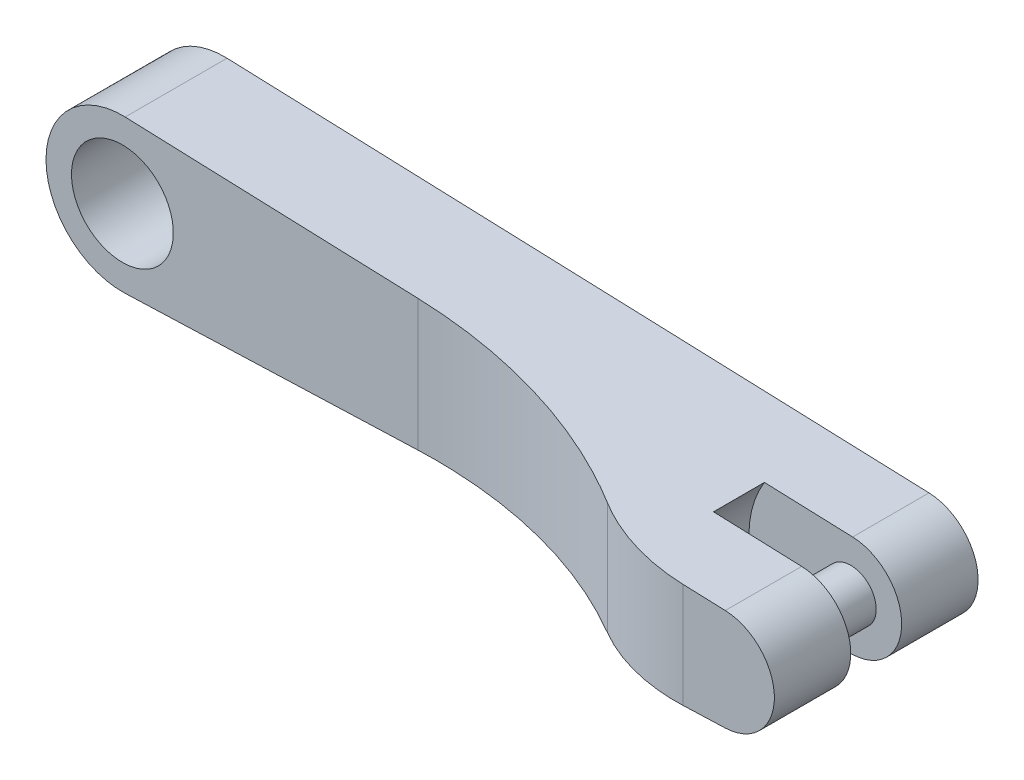
ISO-10303-21;
HEADER;
FILE_DESCRIPTION(('STEP AP214'),'2;1');
FILE_NAME('part.step','',(''),(''),'','','');
FILE_SCHEMA(('AUTOMOTIVE_DESIGN { 1 0 10303 214 1 1 1 1 }'));
ENDSEC;
DATA;
#1=APPLICATION_CONTEXT('core data for automotive mechanical design processes');
#2=APPLICATION_PROTOCOL_DEFINITION('international standard','automotive_design',2000,#1);
#3=PRODUCT_CONTEXT('',#1,'mechanical');
#4=PRODUCT('Part','Part','',(#3));
#5=PRODUCT_RELATED_PRODUCT_CATEGORY('part','',(#4));
#6=PRODUCT_DEFINITION_FORMATION('','',#4);
#7=PRODUCT_DEFINITION_CONTEXT('part definition',#1,'design');
#8=PRODUCT_DEFINITION('design','',#6,#7);
#9=PRODUCT_DEFINITION_SHAPE('','',#8);
#10=(LENGTH_UNIT() NAMED_UNIT(*) SI_UNIT(.MILLI.,.METRE.));
#11=(NAMED_UNIT(*) PLANE_ANGLE_UNIT() SI_UNIT($,.RADIAN.));
#12=(NAMED_UNIT(*) SI_UNIT($,.STERADIAN.) SOLID_ANGLE_UNIT());
#13=UNCERTAINTY_MEASURE_WITH_UNIT(LENGTH_MEASURE(1.E-05),#10,'distance_accuracy_value','');
#14=(GEOMETRIC_REPRESENTATION_CONTEXT(3) GLOBAL_UNCERTAINTY_ASSIGNED_CONTEXT((#13)) GLOBAL_UNIT_ASSIGNED_CONTEXT((#10,
#11,#12)) REPRESENTATION_CONTEXT('',''));
#15=CARTESIAN_POINT('',(0.,0.,0.));
#16=DIRECTION('',(0.,0.,1.));
#17=DIRECTION('',(1.,0.,0.));
#18=AXIS2_PLACEMENT_3D('',#15,#16,#17);
#19=CARTESIAN_POINT('',(-287.282608695652,-74.9507557300062,50.));
#20=DIRECTION('',(-0.036231884057971,0.999343409733416,0.));
#21=DIRECTION('',(-0.999343409733416,-0.036231884057971,0.));
#22=AXIS2_PLACEMENT_3D('',#19,#20,#21);
#23=PLANE('',#22);
#24=DIRECTION('',(0.999343409733416,0.036231884057971,0.));
#25=VECTOR('',#24,1.);
#26=CARTESIAN_POINT('',(-287.282608695652,-74.9507557300062,150.));
#27=LINE('',#26,#25);
#28=CARTESIAN_POINT('',(360.555127546399,-51.4629521188713,150.));
#29=VERTEX_POINT('',#28);
#30=CARTESIAN_POINT('',(401.811594202899,-49.9671704866708,150.));
#31=VERTEX_POINT('',#30);
#32=EDGE_CURVE('E177',#29,#31,#27,.T.);
#33=ORIENTED_EDGE('',*,*,#32,.F.);
#34=CARTESIAN_POINT('',(360.555127546399,-51.4629521188713,-50.));
#35=DIRECTION('',(-0.036231884057971,0.999343409733416,0.));
#36=DIRECTION('',(-0.999343409733416,-0.036231884057971,0.));
#37=AXIS2_PLACEMENT_3D('',#34,#35,#36);
#38=ELLIPSE('',#37,200.131404332122,200.);
#39=CARTESIAN_POINT('',(257.539376818856,-55.1978591589856,121.428571428571));
#40=VERTEX_POINT('',#39);
#41=EDGE_CURVE('E62',#29,#40,#38,.F.);
#42=ORIENTED_EDGE('',*,*,#41,.T.);
#43=CARTESIAN_POINT('',(0.,-64.5351267592713,550.));
#44=DIRECTION('',(-0.036231884057971,0.999343409733416,0.));
#45=DIRECTION('',(0.999343409733416,0.036231884057971,0.));
#46=AXIS2_PLACEMENT_3D('',#43,#44,#45);
#47=ELLIPSE('',#46,500.328510830306,500.);
#48=CARTESIAN_POINT('',(0.,-64.5351267592713,50.));
#49=VERTEX_POINT('',#48);
#50=EDGE_CURVE('E138',#40,#49,#47,.T.);
#51=ORIENTED_EDGE('',*,*,#50,.T.);
#52=DIRECTION('',(-0.999343409733416,-0.036231884057971,0.));
#53=VECTOR('',#52,1.);
#54=CARTESIAN_POINT('',(-364.899795788734,-77.7648203411018,50.));
#55=LINE('',#54,#53);
#56=CARTESIAN_POINT('',(-287.282608695652,-74.9507557300062,50.));
#57=VERTEX_POINT('',#56);
#58=EDGE_CURVE('E125',#49,#57,#55,.T.);
#59=ORIENTED_EDGE('',*,*,#58,.T.);
#60=DIRECTION('',(0.,0.,-1.));
#61=VECTOR('',#60,1.);
#62=CARTESIAN_POINT('',(-287.282608695652,-74.9507557300062,50.));
#63=LINE('',#62,#61);
#64=CARTESIAN_POINT('',(-287.282608695652,-74.9507557300062,-50.));
#65=VERTEX_POINT('',#64);
#66=EDGE_CURVE('E136',#57,#65,#63,.T.);
#67=ORIENTED_EDGE('',*,*,#66,.T.);
#68=DIRECTION('',(0.999343409733416,0.036231884057971,0.));
#69=VECTOR('',#68,1.);
#70=CARTESIAN_POINT('',(-287.282608695652,-74.9507557300062,-50.));
#71=LINE('',#70,#69);
#72=CARTESIAN_POINT('',(401.811594202899,-49.9671704866708,-50.));
#73=VERTEX_POINT('',#72);
#74=EDGE_CURVE('E205',#65,#73,#71,.T.);
#75=ORIENTED_EDGE('',*,*,#74,.T.);
#76=DIRECTION('',(0.,0.,-1.));
#77=VECTOR('',#76,1.);
#78=CARTESIAN_POINT('',(401.811594202899,-49.9671704866708,50.));
#79=LINE('',#78,#77);
#80=CARTESIAN_POINT('',(401.811594202899,-49.9671704866708,25.));
#81=VERTEX_POINT('',#80);
#82=EDGE_CURVE('E156',#81,#73,#79,.T.);
#83=ORIENTED_EDGE('',*,*,#82,.F.);
#84=DIRECTION('',(0.999343409733416,0.036231884057971,0.));
#85=VECTOR('',#84,1.);
#86=CARTESIAN_POINT('',(-287.282608695652,-74.9507557300062,25.));
#87=LINE('',#86,#85);
#88=CARTESIAN_POINT('',(315.265916209529,-53.1049436887883,25.));
#89=VERTEX_POINT('',#88);
#90=EDGE_CURVE('E193',#89,#81,#87,.T.);
#91=ORIENTED_EDGE('',*,*,#90,.F.);
#92=DIRECTION('',(0.,0.,1.));
#93=VECTOR('',#92,1.);
#94=CARTESIAN_POINT('',(315.265916209529,-53.1049436887883,25.));
#95=LINE('',#94,#93);
#96=CARTESIAN_POINT('',(315.265916209529,-53.1049436887883,75.));
#97=VERTEX_POINT('',#96);
#98=EDGE_CURVE('E187',#89,#97,#95,.T.);
#99=ORIENTED_EDGE('',*,*,#98,.T.);
#100=DIRECTION('',(0.999343409733416,0.036231884057971,0.));
#101=VECTOR('',#100,1.);
#102=CARTESIAN_POINT('',(-287.282608695652,-74.9507557300062,75.));
#103=LINE('',#102,#101);
#104=CARTESIAN_POINT('',(401.811594202899,-49.9671704866708,75.));
#105=VERTEX_POINT('',#104);
#106=EDGE_CURVE('E243',#97,#105,#103,.T.);
#107=ORIENTED_EDGE('',*,*,#106,.T.);
#108=EDGE_CURVE('E148',#31,#105,#79,.T.);
#109=ORIENTED_EDGE('',*,*,#108,.F.);
#110=EDGE_LOOP('',(#33,#42,#51,#59,#67,#75,#83,#91,#99,#107,#109));
#111=FACE_BOUND('',#110,.T.);
#112=ADVANCED_FACE('F39',(#111),#23,.F.);
#113=CARTESIAN_POINT('',(400.,0.,50.));
#114=DIRECTION('',(0.,0.,-1.));
#115=DIRECTION('',(-1.,0.,0.));
#116=AXIS2_PLACEMENT_3D('',#113,#114,#115);
#117=CYLINDRICAL_SURFACE('',#116,50.);
#118=CARTESIAN_POINT('',(400.,0.,25.));
#119=DIRECTION('',(0.,0.,1.));
#120=DIRECTION('',(1.,0.,0.));
#121=AXIS2_PLACEMENT_3D('',#118,#119,#120);
#122=CIRCLE('',#121,50.);
#123=CARTESIAN_POINT('',(401.811594202899,49.9671704866708,25.));
#124=VERTEX_POINT('',#123);
#125=EDGE_CURVE('E241',#81,#124,#122,.T.);
#126=ORIENTED_EDGE('',*,*,#125,.F.);
#127=ORIENTED_EDGE('',*,*,#82,.T.);
#128=CARTESIAN_POINT('',(400.,0.,-50.));
#129=DIRECTION('',(0.,0.,1.));
#130=DIRECTION('',(1.,0.,0.));
#131=AXIS2_PLACEMENT_3D('',#128,#129,#130);
#132=CIRCLE('',#131,50.);
#133=CARTESIAN_POINT('',(401.811594202899,49.9671704866708,-50.));
#134=VERTEX_POINT('',#133);
#135=EDGE_CURVE('E208',#73,#134,#132,.T.);
#136=ORIENTED_EDGE('',*,*,#135,.T.);
#137=DIRECTION('',(0.,0.,-1.));
#138=VECTOR('',#137,1.);
#139=CARTESIAN_POINT('',(401.811594202899,49.9671704866708,50.));
#140=LINE('',#139,#138);
#141=EDGE_CURVE('E218',#124,#134,#140,.T.);
#142=ORIENTED_EDGE('',*,*,#141,.F.);
#143=EDGE_LOOP('',(#126,#127,#136,#142));
#144=FACE_BOUND('',#143,.T.);
#145=ADVANCED_FACE('F232',(#144),#117,.T.);
#146=CARTESIAN_POINT('',(-287.282608695652,74.9507557300062,50.));
#147=DIRECTION('',(-0.036231884057971,-0.999343409733416,0.));
#148=DIRECTION('',(0.999343409733416,-0.036231884057971,0.));
#149=AXIS2_PLACEMENT_3D('',#146,#147,#148);
#150=PLANE('',#149);
#151=CARTESIAN_POINT('',(0.,64.5351267592713,550.));
#152=DIRECTION('',(-0.036231884057971,-0.999343409733416,0.));
#153=DIRECTION('',(0.999343409733416,-0.036231884057971,0.));
#154=AXIS2_PLACEMENT_3D('',#151,#152,#153);
#155=ELLIPSE('',#154,500.328510830306,500.);
#156=CARTESIAN_POINT('',(257.539376818856,55.1978591589856,121.428571428571));
#157=VERTEX_POINT('',#156);
#158=CARTESIAN_POINT('',(0.,64.5351267592713,50.));
#159=VERTEX_POINT('',#158);
#160=EDGE_CURVE('E132',#157,#159,#155,.F.);
#161=ORIENTED_EDGE('',*,*,#160,.F.);
#162=CARTESIAN_POINT('',(360.555127546399,51.4629521188713,-50.));
#163=DIRECTION('',(-0.036231884057971,-0.999343409733416,0.));
#164=DIRECTION('',(0.999343409733416,-0.036231884057971,0.));
#165=AXIS2_PLACEMENT_3D('',#162,#163,#164);
#166=ELLIPSE('',#165,200.131404332122,200.);
#167=CARTESIAN_POINT('',(360.555127546399,51.4629521188713,150.));
#168=VERTEX_POINT('',#167);
#169=EDGE_CURVE('E11',#157,#168,#166,.F.);
#170=ORIENTED_EDGE('',*,*,#169,.T.);
#171=DIRECTION('',(-0.999343409733416,0.036231884057971,0.));
#172=VECTOR('',#171,1.);
#173=CARTESIAN_POINT('',(401.811594202899,49.9671704866708,150.));
#174=LINE('',#173,#172);
#175=CARTESIAN_POINT('',(401.811594202899,49.9671704866708,150.));
#176=VERTEX_POINT('',#175);
#177=EDGE_CURVE('E180',#176,#168,#174,.T.);
#178=ORIENTED_EDGE('',*,*,#177,.F.);
#179=CARTESIAN_POINT('',(401.811594202899,49.9671704866708,75.));
#180=VERTEX_POINT('',#179);
#181=EDGE_CURVE('E219',#176,#180,#140,.T.);
#182=ORIENTED_EDGE('',*,*,#181,.T.);
#183=DIRECTION('',(-0.999343409733416,0.036231884057971,0.));
#184=VECTOR('',#183,1.);
#185=CARTESIAN_POINT('',(-287.282608695652,74.9507557300062,75.));
#186=LINE('',#185,#184);
#187=CARTESIAN_POINT('',(315.265916209529,53.1049436887883,75.));
#188=VERTEX_POINT('',#187);
#189=EDGE_CURVE('E147',#180,#188,#186,.T.);
#190=ORIENTED_EDGE('',*,*,#189,.T.);
#191=DIRECTION('',(0.,0.,1.));
#192=VECTOR('',#191,1.);
#193=CARTESIAN_POINT('',(315.265916209529,53.1049436887883,25.));
#194=LINE('',#193,#192);
#195=CARTESIAN_POINT('',(315.265916209529,53.1049436887883,25.));
#196=VERTEX_POINT('',#195);
#197=EDGE_CURVE('E153',#188,#196,#194,.F.);
#198=ORIENTED_EDGE('',*,*,#197,.T.);
#199=DIRECTION('',(-0.999343409733416,0.036231884057971,0.));
#200=VECTOR('',#199,1.);
#201=CARTESIAN_POINT('',(-287.282608695652,74.9507557300062,25.));
#202=LINE('',#201,#200);
#203=EDGE_CURVE('E163',#124,#196,#202,.T.);
#204=ORIENTED_EDGE('',*,*,#203,.F.);
#205=ORIENTED_EDGE('',*,*,#141,.T.);
#206=DIRECTION('',(-0.999343409733416,0.036231884057971,0.));
#207=VECTOR('',#206,1.);
#208=CARTESIAN_POINT('',(-287.282608695652,74.9507557300062,-50.));
#209=LINE('',#208,#207);
#210=CARTESIAN_POINT('',(-287.282608695652,74.9507557300062,-50.));
#211=VERTEX_POINT('',#210);
#212=EDGE_CURVE('E212',#134,#211,#209,.T.);
#213=ORIENTED_EDGE('',*,*,#212,.T.);
#214=DIRECTION('',(0.,0.,-1.));
#215=VECTOR('',#214,1.);
#216=CARTESIAN_POINT('',(-287.282608695652,74.9507557300062,50.));
#217=LINE('',#216,#215);
#218=CARTESIAN_POINT('',(-287.282608695652,74.9507557300062,50.));
#219=VERTEX_POINT('',#218);
#220=EDGE_CURVE('E216',#219,#211,#217,.T.);
#221=ORIENTED_EDGE('',*,*,#220,.F.);
#222=DIRECTION('',(-0.999343409733416,0.036231884057971,0.));
#223=VECTOR('',#222,1.);
#224=CARTESIAN_POINT('',(-364.899795788734,77.7648203411018,50.));
#225=LINE('',#224,#223);
#226=EDGE_CURVE('E127',#159,#219,#225,.T.);
#227=ORIENTED_EDGE('',*,*,#226,.F.);
#228=EDGE_LOOP('',(#161,#170,#178,#182,#190,#198,#204,#205,#213,#221,#227));
#229=FACE_BOUND('',#228,.T.);
#230=ADVANCED_FACE('F227',(#229),#150,.F.);
#231=CARTESIAN_POINT('',(-290.,0.,-50.));
#232=DIRECTION('',(0.,0.,1.));
#233=DIRECTION('',(1.,0.,0.));
#234=AXIS2_PLACEMENT_3D('',#231,#232,#233);
#235=PLANE('',#234);
#236=CARTESIAN_POINT('',(-290.,0.,-50.));
#237=DIRECTION('',(0.,0.,1.));
#238=DIRECTION('',(1.,0.,0.));
#239=AXIS2_PLACEMENT_3D('',#236,#237,#238);
#240=CIRCLE('',#239,75.);
#241=EDGE_CURVE('E145',#211,#65,#240,.T.);
#242=ORIENTED_EDGE('',*,*,#241,.F.);
#243=ORIENTED_EDGE('',*,*,#212,.F.);
#244=ORIENTED_EDGE('',*,*,#135,.F.);
#245=ORIENTED_EDGE('',*,*,#74,.F.);
#246=EDGE_LOOP('',(#242,#243,#244,#245));
#247=FACE_BOUND('',#246,.T.);
#248=CARTESIAN_POINT('',(-290.,0.,-50.));
#249=DIRECTION('',(0.,0.,1.));
#250=DIRECTION('',(1.,0.,0.));
#251=AXIS2_PLACEMENT_3D('',#248,#249,#250);
#252=CIRCLE('',#251,50.);
#253=CARTESIAN_POINT('',(-240.,0.,-50.));
#254=VERTEX_POINT('',#253);
#255=EDGE_CURVE('E199',#254,#254,#252,.T.);
#256=ORIENTED_EDGE('',*,*,#255,.T.);
#257=EDGE_LOOP('',(#256));
#258=FACE_BOUND('',#257,.T.);
#259=ADVANCED_FACE('F235',(#247,#258),#235,.F.);
#260=CARTESIAN_POINT('',(-290.,0.,50.));
#261=DIRECTION('',(0.,0.,-1.));
#262=DIRECTION('',(-1.,0.,0.));
#263=AXIS2_PLACEMENT_3D('',#260,#261,#262);
#264=CYLINDRICAL_SURFACE('',#263,75.);
#265=ORIENTED_EDGE('',*,*,#66,.F.);
#266=CARTESIAN_POINT('',(-290.,0.,50.));
#267=DIRECTION('',(0.,0.,-1.));
#268=DIRECTION('',(-1.,0.,0.));
#269=AXIS2_PLACEMENT_3D('',#266,#267,#268);
#270=CIRCLE('',#269,75.);
#271=EDGE_CURVE('E121',#219,#57,#270,.F.);
#272=ORIENTED_EDGE('',*,*,#271,.F.);
#273=ORIENTED_EDGE('',*,*,#220,.T.);
#274=ORIENTED_EDGE('',*,*,#241,.T.);
#275=EDGE_LOOP('',(#265,#272,#273,#274));
#276=FACE_BOUND('',#275,.T.);
#277=ADVANCED_FACE('F143',(#276),#264,.T.);
#278=ORIENTED_EDGE('',*,*,#108,.T.);
#279=CARTESIAN_POINT('',(400.,0.,75.));
#280=DIRECTION('',(0.,0.,1.));
#281=DIRECTION('',(1.,0.,0.));
#282=AXIS2_PLACEMENT_3D('',#279,#280,#281);
#283=CIRCLE('',#282,50.);
#284=EDGE_CURVE('E248',#105,#180,#283,.T.);
#285=ORIENTED_EDGE('',*,*,#284,.T.);
#286=ORIENTED_EDGE('',*,*,#181,.F.);
#287=CARTESIAN_POINT('',(400.,0.,150.));
#288=DIRECTION('',(0.,0.,1.));
#289=DIRECTION('',(1.,0.,0.));
#290=AXIS2_PLACEMENT_3D('',#287,#288,#289);
#291=CIRCLE('',#290,50.);
#292=EDGE_CURVE('E186',#31,#176,#291,.T.);
#293=ORIENTED_EDGE('',*,*,#292,.F.);
#294=EDGE_LOOP('',(#278,#285,#286,#293));
#295=FACE_BOUND('',#294,.T.);
#296=ADVANCED_FACE('F298',(#295),#117,.T.);
#297=CARTESIAN_POINT('',(-290.,0.,50.));
#298=DIRECTION('',(0.,0.,-1.));
#299=DIRECTION('',(-1.,0.,0.));
#300=AXIS2_PLACEMENT_3D('',#297,#298,#299);
#301=CYLINDRICAL_SURFACE('',#300,50.);
#302=CARTESIAN_POINT('',(-290.,0.,50.));
#303=DIRECTION('',(0.,0.,-1.));
#304=DIRECTION('',(-1.,0.,0.));
#305=AXIS2_PLACEMENT_3D('',#302,#303,#304);
#306=CIRCLE('',#305,50.);
#307=CARTESIAN_POINT('',(-340.,0.,50.));
#308=VERTEX_POINT('',#307);
#309=EDGE_CURVE('E133',#308,#308,#306,.F.);
#310=ORIENTED_EDGE('',*,*,#309,.T.);
#311=EDGE_LOOP('',(#310));
#312=FACE_BOUND('',#311,.T.);
#313=ORIENTED_EDGE('',*,*,#255,.F.);
#314=EDGE_LOOP('',(#313));
#315=FACE_BOUND('',#314,.T.);
#316=ADVANCED_FACE('F280',(#312,#315),#301,.F.);
#317=CARTESIAN_POINT('',(-290.,0.,150.));
#318=DIRECTION('',(0.,0.,1.));
#319=DIRECTION('',(1.,0.,0.));
#320=AXIS2_PLACEMENT_3D('',#317,#318,#319);
#321=PLANE('',#320);
#322=ORIENTED_EDGE('',*,*,#177,.T.);
#323=DIRECTION('',(0.,1.,0.));
#324=VECTOR('',#323,1.);
#325=CARTESIAN_POINT('',(360.555127546399,-53.6584200020908,150.));
#326=LINE('',#325,#324);
#327=EDGE_CURVE('E166',#168,#29,#326,.F.);
#328=ORIENTED_EDGE('',*,*,#327,.T.);
#329=ORIENTED_EDGE('',*,*,#32,.T.);
#330=ORIENTED_EDGE('',*,*,#292,.T.);
#331=EDGE_LOOP('',(#322,#328,#329,#330));
#332=FACE_BOUND('',#331,.T.);
#333=ADVANCED_FACE('F175',(#332),#321,.T.);
#334=CARTESIAN_POINT('',(400.,0.,25.));
#335=DIRECTION('',(0.,0.,1.));
#336=DIRECTION('',(1.,0.,0.));
#337=AXIS2_PLACEMENT_3D('',#334,#335,#336);
#338=CYLINDRICAL_SURFACE('',#337,100.);
#339=CARTESIAN_POINT('',(400.,0.,25.));
#340=DIRECTION('',(0.,0.,1.));
#341=DIRECTION('',(1.,0.,0.));
#342=AXIS2_PLACEMENT_3D('',#339,#340,#341);
#343=CIRCLE('',#342,100.);
#344=EDGE_CURVE('E252',#196,#89,#343,.T.);
#345=ORIENTED_EDGE('',*,*,#344,.F.);
#346=ORIENTED_EDGE('',*,*,#197,.F.);
#347=CARTESIAN_POINT('',(400.,0.,75.));
#348=DIRECTION('',(0.,0.,1.));
#349=DIRECTION('',(1.,0.,0.));
#350=AXIS2_PLACEMENT_3D('',#347,#348,#349);
#351=CIRCLE('',#350,100.);
#352=EDGE_CURVE('E259',#188,#97,#351,.T.);
#353=ORIENTED_EDGE('',*,*,#352,.T.);
#354=ORIENTED_EDGE('',*,*,#98,.F.);
#355=EDGE_LOOP('',(#345,#346,#353,#354));
#356=FACE_BOUND('',#355,.T.);
#357=ADVANCED_FACE('F315',(#356),#338,.F.);
#358=CARTESIAN_POINT('',(400.,0.,25.));
#359=DIRECTION('',(0.,0.,1.));
#360=DIRECTION('',(1.,0.,0.));
#361=AXIS2_PLACEMENT_3D('',#358,#359,#360);
#362=PLANE('',#361);
#363=CARTESIAN_POINT('',(400.,0.,25.));
#364=DIRECTION('',(0.,0.,1.));
#365=DIRECTION('',(1.,0.,0.));
#366=AXIS2_PLACEMENT_3D('',#363,#364,#365);
#367=CIRCLE('',#366,25.);
#368=CARTESIAN_POINT('',(425.,0.,25.));
#369=VERTEX_POINT('',#368);
#370=EDGE_CURVE('E255',#369,#369,#367,.T.);
#371=ORIENTED_EDGE('',*,*,#370,.F.);
#372=EDGE_LOOP('',(#371));
#373=FACE_BOUND('',#372,.T.);
#374=ORIENTED_EDGE('',*,*,#90,.T.);
#375=ORIENTED_EDGE('',*,*,#125,.T.);
#376=ORIENTED_EDGE('',*,*,#203,.T.);
#377=ORIENTED_EDGE('',*,*,#344,.T.);
#378=EDGE_LOOP('',(#374,#375,#376,#377));
#379=FACE_BOUND('',#378,.T.);
#380=ADVANCED_FACE('F318',(#373,#379),#362,.T.);
#381=CARTESIAN_POINT('',(400.,0.,75.));
#382=DIRECTION('',(0.,0.,1.));
#383=DIRECTION('',(1.,0.,0.));
#384=AXIS2_PLACEMENT_3D('',#381,#382,#383);
#385=PLANE('',#384);
#386=CARTESIAN_POINT('',(400.,0.,75.));
#387=DIRECTION('',(0.,0.,1.));
#388=DIRECTION('',(1.,0.,0.));
#389=AXIS2_PLACEMENT_3D('',#386,#387,#388);
#390=CIRCLE('',#389,25.);
#391=CARTESIAN_POINT('',(425.,0.,75.));
#392=VERTEX_POINT('',#391);
#393=EDGE_CURVE('E263',#392,#392,#390,.T.);
#394=ORIENTED_EDGE('',*,*,#393,.T.);
#395=EDGE_LOOP('',(#394));
#396=FACE_BOUND('',#395,.T.);
#397=ORIENTED_EDGE('',*,*,#352,.F.);
#398=ORIENTED_EDGE('',*,*,#189,.F.);
#399=ORIENTED_EDGE('',*,*,#284,.F.);
#400=ORIENTED_EDGE('',*,*,#106,.F.);
#401=EDGE_LOOP('',(#397,#398,#399,#400));
#402=FACE_BOUND('',#401,.T.);
#403=ADVANCED_FACE('F322',(#396,#402),#385,.F.);
#404=CARTESIAN_POINT('',(400.,0.,25.));
#405=DIRECTION('',(0.,0.,1.));
#406=DIRECTION('',(1.,0.,0.));
#407=AXIS2_PLACEMENT_3D('',#404,#405,#406);
#408=CYLINDRICAL_SURFACE('',#407,25.);
#409=ORIENTED_EDGE('',*,*,#370,.T.);
#410=EDGE_LOOP('',(#409));
#411=FACE_BOUND('',#410,.T.);
#412=ORIENTED_EDGE('',*,*,#393,.F.);
#413=EDGE_LOOP('',(#412));
#414=FACE_BOUND('',#413,.T.);
#415=ADVANCED_FACE('F290',(#411,#414),#408,.T.);
#416=CARTESIAN_POINT('',(0.,75.001,550.));
#417=DIRECTION('',(0.,-1.,0.));
#418=DIRECTION('',(0.,0.,-1.));
#419=AXIS2_PLACEMENT_3D('',#416,#417,#418);
#420=CYLINDRICAL_SURFACE('',#419,500.);
#421=ORIENTED_EDGE('',*,*,#50,.F.);
#422=DIRECTION('',(0.,-1.,0.));
#423=VECTOR('',#422,1.);
#424=CARTESIAN_POINT('',(257.539376818856,75.001,121.428571428571));
#425=LINE('',#424,#423);
#426=EDGE_CURVE('E48',#40,#157,#425,.F.);
#427=ORIENTED_EDGE('',*,*,#426,.T.);
#428=ORIENTED_EDGE('',*,*,#160,.T.);
#429=DIRECTION('',(0.,-1.,0.));
#430=VECTOR('',#429,1.);
#431=CARTESIAN_POINT('',(0.,75.001,50.));
#432=LINE('',#431,#430);
#433=EDGE_CURVE('E269',#159,#49,#432,.T.);
#434=ORIENTED_EDGE('',*,*,#433,.T.);
#435=EDGE_LOOP('',(#421,#427,#428,#434));
#436=FACE_BOUND('',#435,.T.);
#437=ADVANCED_FACE('F284',(#436),#420,.F.);
#438=CARTESIAN_POINT('',(-365.,75.001,50.));
#439=DIRECTION('',(0.,0.,-1.));
#440=DIRECTION('',(-1.,0.,0.));
#441=AXIS2_PLACEMENT_3D('',#438,#439,#440);
#442=PLANE('',#441);
#443=ORIENTED_EDGE('',*,*,#309,.F.);
#444=EDGE_LOOP('',(#443));
#445=FACE_BOUND('',#444,.T.);
#446=ORIENTED_EDGE('',*,*,#226,.T.);
#447=ORIENTED_EDGE('',*,*,#271,.T.);
#448=ORIENTED_EDGE('',*,*,#58,.F.);
#449=ORIENTED_EDGE('',*,*,#433,.F.);
#450=EDGE_LOOP('',(#446,#447,#448,#449));
#451=FACE_BOUND('',#450,.T.);
#452=ADVANCED_FACE('F123',(#445,#451),#442,.F.);
#453=CARTESIAN_POINT('',(360.555127546399,75.001,-50.));
#454=DIRECTION('',(0.,-1.,0.));
#455=DIRECTION('',(0.,0.,-1.));
#456=AXIS2_PLACEMENT_3D('',#453,#454,#455);
#457=CYLINDRICAL_SURFACE('',#456,200.);
#458=ORIENTED_EDGE('',*,*,#169,.F.);
#459=ORIENTED_EDGE('',*,*,#426,.F.);
#460=ORIENTED_EDGE('',*,*,#41,.F.);
#461=ORIENTED_EDGE('',*,*,#327,.F.);
#462=EDGE_LOOP('',(#458,#459,#460,#461));
#463=FACE_BOUND('',#462,.T.);
#464=ADVANCED_FACE('F41',(#463),#457,.T.);
#465=CLOSED_SHELL('',(#112,#145,#230,#259,#277,#296,#316,#333,#357,#380,#403,#415,#437,#452,#464));
#466=MANIFOLD_SOLID_BREP('B2',#465);
#467=ADVANCED_BREP_SHAPE_REPRESENTATION('',(#18,#466),#14);
#468=SHAPE_DEFINITION_REPRESENTATION(#9,#467);
ENDSEC;
END-ISO-10303-21;
